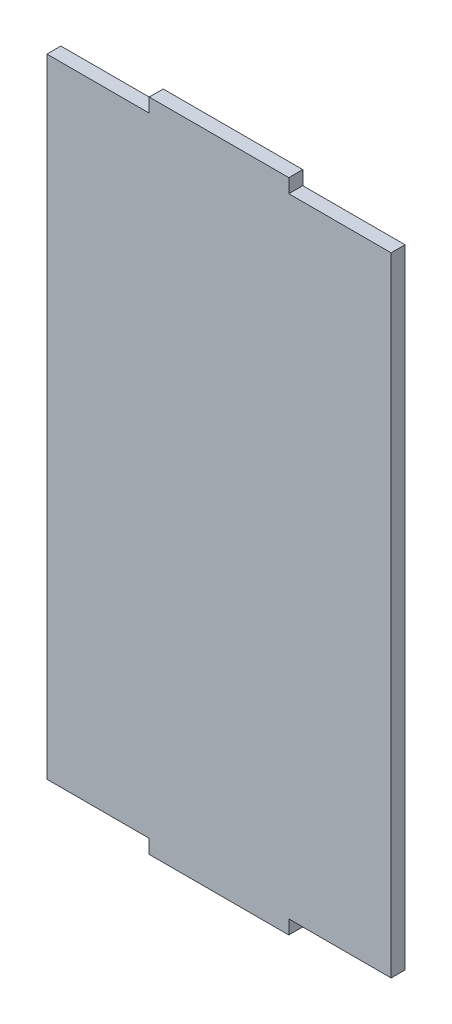
ISO-10303-21;
HEADER;
FILE_DESCRIPTION(('STEP AP214'),'2;1');
FILE_NAME('part.step','',(''),(''),'','','');
FILE_SCHEMA(('AUTOMOTIVE_DESIGN { 1 0 10303 214 1 1 1 1 }'));
ENDSEC;
DATA;
#1=APPLICATION_CONTEXT('core data for automotive mechanical design processes');
#2=APPLICATION_PROTOCOL_DEFINITION('international standard','automotive_design',2000,#1);
#3=PRODUCT_CONTEXT('',#1,'mechanical');
#4=PRODUCT('Part','Part','',(#3));
#5=PRODUCT_RELATED_PRODUCT_CATEGORY('part','',(#4));
#6=PRODUCT_DEFINITION_FORMATION('','',#4);
#7=PRODUCT_DEFINITION_CONTEXT('part definition',#1,'design');
#8=PRODUCT_DEFINITION('design','',#6,#7);
#9=PRODUCT_DEFINITION_SHAPE('','',#8);
#10=(LENGTH_UNIT() NAMED_UNIT(*) SI_UNIT(.MILLI.,.METRE.));
#11=(NAMED_UNIT(*) PLANE_ANGLE_UNIT() SI_UNIT($,.RADIAN.));
#12=(NAMED_UNIT(*) SI_UNIT($,.STERADIAN.) SOLID_ANGLE_UNIT());
#13=UNCERTAINTY_MEASURE_WITH_UNIT(LENGTH_MEASURE(1.E-05),#10,'distance_accuracy_value','');
#14=(GEOMETRIC_REPRESENTATION_CONTEXT(3) GLOBAL_UNCERTAINTY_ASSIGNED_CONTEXT((#13)) GLOBAL_UNIT_ASSIGNED_CONTEXT((#10,
#11,#12)) REPRESENTATION_CONTEXT('',''));
#15=CARTESIAN_POINT('',(0.,0.,0.));
#16=DIRECTION('',(0.,0.,1.));
#17=DIRECTION('',(1.,0.,0.));
#18=AXIS2_PLACEMENT_3D('',#15,#16,#17);
#19=CARTESIAN_POINT('',(0.,0.,3.));
#20=DIRECTION('',(1.,0.,0.));
#21=DIRECTION('',(0.,0.,-1.));
#22=AXIS2_PLACEMENT_3D('',#19,#20,#21);
#23=PLANE('',#22);
#24=DIRECTION('',(0.,-1.,0.));
#25=VECTOR('',#24,1.);
#26=CARTESIAN_POINT('',(0.,0.,0.));
#27=LINE('',#26,#25);
#28=CARTESIAN_POINT('',(0.,135.,0.));
#29=VERTEX_POINT('',#28);
#30=CARTESIAN_POINT('',(0.,0.,0.));
#31=VERTEX_POINT('',#30);
#32=EDGE_CURVE('E164',#29,#31,#27,.T.);
#33=ORIENTED_EDGE('',*,*,#32,.T.);
#34=DIRECTION('',(0.,0.,-1.));
#35=VECTOR('',#34,1.);
#36=CARTESIAN_POINT('',(0.,0.,3.));
#37=LINE('',#36,#35);
#38=CARTESIAN_POINT('',(0.,0.,3.));
#39=VERTEX_POINT('',#38);
#40=EDGE_CURVE('E11',#39,#31,#37,.T.);
#41=ORIENTED_EDGE('',*,*,#40,.F.);
#42=DIRECTION('',(0.,-1.,0.));
#43=VECTOR('',#42,1.);
#44=CARTESIAN_POINT('',(0.,0.,3.));
#45=LINE('',#44,#43);
#46=CARTESIAN_POINT('',(0.,135.,3.));
#47=VERTEX_POINT('',#46);
#48=EDGE_CURVE('E198',#47,#39,#45,.T.);
#49=ORIENTED_EDGE('',*,*,#48,.F.);
#50=DIRECTION('',(0.,0.,-1.));
#51=VECTOR('',#50,1.);
#52=CARTESIAN_POINT('',(0.,135.,3.));
#53=LINE('',#52,#51);
#54=EDGE_CURVE('E160',#47,#29,#53,.T.);
#55=ORIENTED_EDGE('',*,*,#54,.T.);
#56=EDGE_LOOP('',(#33,#41,#49,#55));
#57=FACE_BOUND('',#56,.T.);
#58=ADVANCED_FACE('F39',(#57),#23,.F.);
#59=CARTESIAN_POINT('',(0.,0.,3.));
#60=DIRECTION('',(0.,1.,0.));
#61=DIRECTION('',(0.,0.,1.));
#62=AXIS2_PLACEMENT_3D('',#59,#60,#61);
#63=PLANE('',#62);
#64=DIRECTION('',(1.,0.,0.));
#65=VECTOR('',#64,1.);
#66=CARTESIAN_POINT('',(0.,0.,0.));
#67=LINE('',#66,#65);
#68=CARTESIAN_POINT('',(22.,0.,0.));
#69=VERTEX_POINT('',#68);
#70=EDGE_CURVE('E168',#31,#69,#67,.T.);
#71=ORIENTED_EDGE('',*,*,#70,.T.);
#72=DIRECTION('',(0.,0.,-1.));
#73=VECTOR('',#72,1.);
#74=CARTESIAN_POINT('',(22.,0.,3.));
#75=LINE('',#74,#73);
#76=CARTESIAN_POINT('',(22.,0.,3.));
#77=VERTEX_POINT('',#76);
#78=EDGE_CURVE('E48',#77,#69,#75,.T.);
#79=ORIENTED_EDGE('',*,*,#78,.F.);
#80=DIRECTION('',(1.,0.,0.));
#81=VECTOR('',#80,1.);
#82=CARTESIAN_POINT('',(0.,0.,3.));
#83=LINE('',#82,#81);
#84=EDGE_CURVE('E111',#39,#77,#83,.T.);
#85=ORIENTED_EDGE('',*,*,#84,.F.);
#86=ORIENTED_EDGE('',*,*,#40,.T.);
#87=EDGE_LOOP('',(#71,#79,#85,#86));
#88=FACE_BOUND('',#87,.T.);
#89=ADVANCED_FACE('F292',(#88),#63,.F.);
#90=CARTESIAN_POINT('',(22.,0.,3.));
#91=DIRECTION('',(1.,0.,0.));
#92=DIRECTION('',(0.,0.,-1.));
#93=AXIS2_PLACEMENT_3D('',#90,#91,#92);
#94=PLANE('',#93);
#95=DIRECTION('',(0.,-1.,0.));
#96=VECTOR('',#95,1.);
#97=CARTESIAN_POINT('',(22.,0.,0.));
#98=LINE('',#97,#96);
#99=CARTESIAN_POINT('',(22.,-3.,0.));
#100=VERTEX_POINT('',#99);
#101=EDGE_CURVE('E171',#69,#100,#98,.T.);
#102=ORIENTED_EDGE('',*,*,#101,.T.);
#103=DIRECTION('',(0.,0.,-1.));
#104=VECTOR('',#103,1.);
#105=CARTESIAN_POINT('',(22.,-3.,3.));
#106=LINE('',#105,#104);
#107=CARTESIAN_POINT('',(22.,-3.,3.));
#108=VERTEX_POINT('',#107);
#109=EDGE_CURVE('E225',#108,#100,#106,.T.);
#110=ORIENTED_EDGE('',*,*,#109,.F.);
#111=DIRECTION('',(0.,-1.,0.));
#112=VECTOR('',#111,1.);
#113=CARTESIAN_POINT('',(22.,0.,3.));
#114=LINE('',#113,#112);
#115=EDGE_CURVE('E235',#77,#108,#114,.T.);
#116=ORIENTED_EDGE('',*,*,#115,.F.);
#117=ORIENTED_EDGE('',*,*,#78,.T.);
#118=EDGE_LOOP('',(#102,#110,#116,#117));
#119=FACE_BOUND('',#118,.T.);
#120=ADVANCED_FACE('F233',(#119),#94,.F.);
#121=CARTESIAN_POINT('',(22.,-3.,3.));
#122=DIRECTION('',(0.,1.,0.));
#123=DIRECTION('',(-1.,0.,0.));
#124=AXIS2_PLACEMENT_3D('',#121,#122,#123);
#125=PLANE('',#124);
#126=DIRECTION('',(1.,0.,0.));
#127=VECTOR('',#126,1.);
#128=CARTESIAN_POINT('',(22.,-3.,0.));
#129=LINE('',#128,#127);
#130=CARTESIAN_POINT('',(52.,-3.,0.));
#131=VERTEX_POINT('',#130);
#132=EDGE_CURVE('E174',#100,#131,#129,.T.);
#133=ORIENTED_EDGE('',*,*,#132,.T.);
#134=DIRECTION('',(0.,0.,-1.));
#135=VECTOR('',#134,1.);
#136=CARTESIAN_POINT('',(52.,-3.,3.));
#137=LINE('',#136,#135);
#138=CARTESIAN_POINT('',(52.,-3.,3.));
#139=VERTEX_POINT('',#138);
#140=EDGE_CURVE('E221',#139,#131,#137,.T.);
#141=ORIENTED_EDGE('',*,*,#140,.F.);
#142=DIRECTION('',(1.,0.,0.));
#143=VECTOR('',#142,1.);
#144=CARTESIAN_POINT('',(22.,-3.,3.));
#145=LINE('',#144,#143);
#146=EDGE_CURVE('E254',#108,#139,#145,.T.);
#147=ORIENTED_EDGE('',*,*,#146,.F.);
#148=ORIENTED_EDGE('',*,*,#109,.T.);
#149=EDGE_LOOP('',(#133,#141,#147,#148));
#150=FACE_BOUND('',#149,.T.);
#151=ADVANCED_FACE('F244',(#150),#125,.F.);
#152=CARTESIAN_POINT('',(52.,0.,3.));
#153=DIRECTION('',(-1.,0.,0.));
#154=DIRECTION('',(0.,-1.,0.));
#155=AXIS2_PLACEMENT_3D('',#152,#153,#154);
#156=PLANE('',#155);
#157=DIRECTION('',(0.,1.,0.));
#158=VECTOR('',#157,1.);
#159=CARTESIAN_POINT('',(52.,0.,0.));
#160=LINE('',#159,#158);
#161=CARTESIAN_POINT('',(52.,0.,0.));
#162=VERTEX_POINT('',#161);
#163=EDGE_CURVE('E177',#131,#162,#160,.T.);
#164=ORIENTED_EDGE('',*,*,#163,.T.);
#165=DIRECTION('',(0.,0.,-1.));
#166=VECTOR('',#165,1.);
#167=CARTESIAN_POINT('',(52.,0.,3.));
#168=LINE('',#167,#166);
#169=CARTESIAN_POINT('',(52.,0.,3.));
#170=VERTEX_POINT('',#169);
#171=EDGE_CURVE('E217',#170,#162,#168,.T.);
#172=ORIENTED_EDGE('',*,*,#171,.F.);
#173=DIRECTION('',(0.,1.,0.));
#174=VECTOR('',#173,1.);
#175=CARTESIAN_POINT('',(52.,0.,3.));
#176=LINE('',#175,#174);
#177=EDGE_CURVE('E250',#139,#170,#176,.T.);
#178=ORIENTED_EDGE('',*,*,#177,.F.);
#179=ORIENTED_EDGE('',*,*,#140,.T.);
#180=EDGE_LOOP('',(#164,#172,#178,#179));
#181=FACE_BOUND('',#180,.T.);
#182=ADVANCED_FACE('F248',(#181),#156,.F.);
#183=CARTESIAN_POINT('',(52.,0.,3.));
#184=DIRECTION('',(0.,1.,0.));
#185=DIRECTION('',(0.,0.,1.));
#186=AXIS2_PLACEMENT_3D('',#183,#184,#185);
#187=PLANE('',#186);
#188=DIRECTION('',(1.,0.,0.));
#189=VECTOR('',#188,1.);
#190=CARTESIAN_POINT('',(52.,0.,0.));
#191=LINE('',#190,#189);
#192=CARTESIAN_POINT('',(74.,0.,0.));
#193=VERTEX_POINT('',#192);
#194=EDGE_CURVE('E180',#162,#193,#191,.T.);
#195=ORIENTED_EDGE('',*,*,#194,.T.);
#196=DIRECTION('',(0.,0.,-1.));
#197=VECTOR('',#196,1.);
#198=CARTESIAN_POINT('',(74.,0.,3.));
#199=LINE('',#198,#197);
#200=CARTESIAN_POINT('',(74.,0.,3.));
#201=VERTEX_POINT('',#200);
#202=EDGE_CURVE('E213',#201,#193,#199,.T.);
#203=ORIENTED_EDGE('',*,*,#202,.F.);
#204=DIRECTION('',(1.,0.,0.));
#205=VECTOR('',#204,1.);
#206=CARTESIAN_POINT('',(52.,0.,3.));
#207=LINE('',#206,#205);
#208=EDGE_CURVE('E253',#170,#201,#207,.T.);
#209=ORIENTED_EDGE('',*,*,#208,.F.);
#210=ORIENTED_EDGE('',*,*,#171,.T.);
#211=EDGE_LOOP('',(#195,#203,#209,#210));
#212=FACE_BOUND('',#211,.T.);
#213=ADVANCED_FACE('F305',(#212),#187,.F.);
#214=CARTESIAN_POINT('',(74.,0.,3.));
#215=DIRECTION('',(-1.,0.,0.));
#216=DIRECTION('',(0.,0.,1.));
#217=AXIS2_PLACEMENT_3D('',#214,#215,#216);
#218=PLANE('',#217);
#219=DIRECTION('',(0.,1.,0.));
#220=VECTOR('',#219,1.);
#221=CARTESIAN_POINT('',(74.,0.,0.));
#222=LINE('',#221,#220);
#223=CARTESIAN_POINT('',(74.,135.,0.));
#224=VERTEX_POINT('',#223);
#225=EDGE_CURVE('E183',#193,#224,#222,.T.);
#226=ORIENTED_EDGE('',*,*,#225,.T.);
#227=DIRECTION('',(0.,0.,-1.));
#228=VECTOR('',#227,1.);
#229=CARTESIAN_POINT('',(74.,135.,3.));
#230=LINE('',#229,#228);
#231=CARTESIAN_POINT('',(74.,135.,3.));
#232=VERTEX_POINT('',#231);
#233=EDGE_CURVE('E209',#232,#224,#230,.T.);
#234=ORIENTED_EDGE('',*,*,#233,.F.);
#235=DIRECTION('',(0.,1.,0.));
#236=VECTOR('',#235,1.);
#237=CARTESIAN_POINT('',(74.,0.,3.));
#238=LINE('',#237,#236);
#239=EDGE_CURVE('E258',#201,#232,#238,.T.);
#240=ORIENTED_EDGE('',*,*,#239,.F.);
#241=ORIENTED_EDGE('',*,*,#202,.T.);
#242=EDGE_LOOP('',(#226,#234,#240,#241));
#243=FACE_BOUND('',#242,.T.);
#244=ADVANCED_FACE('F308',(#243),#218,.F.);
#245=CARTESIAN_POINT('',(52.,135.,3.));
#246=DIRECTION('',(0.,-1.,0.));
#247=DIRECTION('',(0.,0.,-1.));
#248=AXIS2_PLACEMENT_3D('',#245,#246,#247);
#249=PLANE('',#248);
#250=DIRECTION('',(-1.,0.,0.));
#251=VECTOR('',#250,1.);
#252=CARTESIAN_POINT('',(52.,135.,0.));
#253=LINE('',#252,#251);
#254=CARTESIAN_POINT('',(52.,135.,0.));
#255=VERTEX_POINT('',#254);
#256=EDGE_CURVE('E186',#224,#255,#253,.T.);
#257=ORIENTED_EDGE('',*,*,#256,.T.);
#258=DIRECTION('',(0.,0.,-1.));
#259=VECTOR('',#258,1.);
#260=CARTESIAN_POINT('',(52.,135.,3.));
#261=LINE('',#260,#259);
#262=CARTESIAN_POINT('',(52.,135.,3.));
#263=VERTEX_POINT('',#262);
#264=EDGE_CURVE('E205',#263,#255,#261,.T.);
#265=ORIENTED_EDGE('',*,*,#264,.F.);
#266=DIRECTION('',(-1.,0.,0.));
#267=VECTOR('',#266,1.);
#268=CARTESIAN_POINT('',(52.,135.,3.));
#269=LINE('',#268,#267);
#270=EDGE_CURVE('E265',#232,#263,#269,.T.);
#271=ORIENTED_EDGE('',*,*,#270,.F.);
#272=ORIENTED_EDGE('',*,*,#233,.T.);
#273=EDGE_LOOP('',(#257,#265,#271,#272));
#274=FACE_BOUND('',#273,.T.);
#275=ADVANCED_FACE('F273',(#274),#249,.F.);
#276=CARTESIAN_POINT('',(52.,135.,3.));
#277=DIRECTION('',(-1.,0.,0.));
#278=DIRECTION('',(0.,0.,1.));
#279=AXIS2_PLACEMENT_3D('',#276,#277,#278);
#280=PLANE('',#279);
#281=DIRECTION('',(0.,1.,0.));
#282=VECTOR('',#281,1.);
#283=CARTESIAN_POINT('',(52.,135.,0.));
#284=LINE('',#283,#282);
#285=CARTESIAN_POINT('',(52.,138.,0.));
#286=VERTEX_POINT('',#285);
#287=EDGE_CURVE('E189',#255,#286,#284,.T.);
#288=ORIENTED_EDGE('',*,*,#287,.T.);
#289=DIRECTION('',(0.,0.,-1.));
#290=VECTOR('',#289,1.);
#291=CARTESIAN_POINT('',(52.,138.,3.));
#292=LINE('',#291,#290);
#293=CARTESIAN_POINT('',(52.,138.,3.));
#294=VERTEX_POINT('',#293);
#295=EDGE_CURVE('E153',#294,#286,#292,.T.);
#296=ORIENTED_EDGE('',*,*,#295,.F.);
#297=DIRECTION('',(0.,1.,0.));
#298=VECTOR('',#297,1.);
#299=CARTESIAN_POINT('',(52.,135.,3.));
#300=LINE('',#299,#298);
#301=EDGE_CURVE('E142',#263,#294,#300,.T.);
#302=ORIENTED_EDGE('',*,*,#301,.F.);
#303=ORIENTED_EDGE('',*,*,#264,.T.);
#304=EDGE_LOOP('',(#288,#296,#302,#303));
#305=FACE_BOUND('',#304,.T.);
#306=ADVANCED_FACE('F277',(#305),#280,.F.);
#307=CARTESIAN_POINT('',(22.,138.,3.));
#308=DIRECTION('',(0.,-1.,0.));
#309=DIRECTION('',(0.,0.,-1.));
#310=AXIS2_PLACEMENT_3D('',#307,#308,#309);
#311=PLANE('',#310);
#312=DIRECTION('',(-1.,0.,0.));
#313=VECTOR('',#312,1.);
#314=CARTESIAN_POINT('',(22.,138.,0.));
#315=LINE('',#314,#313);
#316=CARTESIAN_POINT('',(22.,138.,0.));
#317=VERTEX_POINT('',#316);
#318=EDGE_CURVE('E151',#286,#317,#315,.T.);
#319=ORIENTED_EDGE('',*,*,#318,.T.);
#320=DIRECTION('',(0.,0.,-1.));
#321=VECTOR('',#320,1.);
#322=CARTESIAN_POINT('',(22.,138.,3.));
#323=LINE('',#322,#321);
#324=CARTESIAN_POINT('',(22.,138.,3.));
#325=VERTEX_POINT('',#324);
#326=EDGE_CURVE('E148',#325,#317,#323,.T.);
#327=ORIENTED_EDGE('',*,*,#326,.F.);
#328=DIRECTION('',(-1.,0.,0.));
#329=VECTOR('',#328,1.);
#330=CARTESIAN_POINT('',(22.,138.,3.));
#331=LINE('',#330,#329);
#332=EDGE_CURVE('E136',#294,#325,#331,.T.);
#333=ORIENTED_EDGE('',*,*,#332,.F.);
#334=ORIENTED_EDGE('',*,*,#295,.T.);
#335=EDGE_LOOP('',(#319,#327,#333,#334));
#336=FACE_BOUND('',#335,.T.);
#337=ADVANCED_FACE('F149',(#336),#311,.F.);
#338=CARTESIAN_POINT('',(22.,135.,3.));
#339=DIRECTION('',(1.,0.,0.));
#340=DIRECTION('',(0.,0.,-1.));
#341=AXIS2_PLACEMENT_3D('',#338,#339,#340);
#342=PLANE('',#341);
#343=DIRECTION('',(0.,-1.,0.));
#344=VECTOR('',#343,1.);
#345=CARTESIAN_POINT('',(22.,135.,0.));
#346=LINE('',#345,#344);
#347=CARTESIAN_POINT('',(22.,135.,0.));
#348=VERTEX_POINT('',#347);
#349=EDGE_CURVE('E97',#317,#348,#346,.T.);
#350=ORIENTED_EDGE('',*,*,#349,.T.);
#351=DIRECTION('',(0.,0.,-1.));
#352=VECTOR('',#351,1.);
#353=CARTESIAN_POINT('',(22.,135.,3.));
#354=LINE('',#353,#352);
#355=CARTESIAN_POINT('',(22.,135.,3.));
#356=VERTEX_POINT('',#355);
#357=EDGE_CURVE('E154',#356,#348,#354,.T.);
#358=ORIENTED_EDGE('',*,*,#357,.F.);
#359=DIRECTION('',(0.,-1.,0.));
#360=VECTOR('',#359,1.);
#361=CARTESIAN_POINT('',(22.,135.,3.));
#362=LINE('',#361,#360);
#363=EDGE_CURVE('E140',#325,#356,#362,.T.);
#364=ORIENTED_EDGE('',*,*,#363,.F.);
#365=ORIENTED_EDGE('',*,*,#326,.T.);
#366=EDGE_LOOP('',(#350,#358,#364,#365));
#367=FACE_BOUND('',#366,.T.);
#368=ADVANCED_FACE('F156',(#367),#342,.F.);
#369=CARTESIAN_POINT('',(0.,135.,3.));
#370=DIRECTION('',(0.,-1.,0.));
#371=DIRECTION('',(0.,0.,-1.));
#372=AXIS2_PLACEMENT_3D('',#369,#370,#371);
#373=PLANE('',#372);
#374=DIRECTION('',(-1.,0.,0.));
#375=VECTOR('',#374,1.);
#376=CARTESIAN_POINT('',(0.,135.,0.));
#377=LINE('',#376,#375);
#378=EDGE_CURVE('E103',#348,#29,#377,.T.);
#379=ORIENTED_EDGE('',*,*,#378,.T.);
#380=ORIENTED_EDGE('',*,*,#54,.F.);
#381=DIRECTION('',(-1.,0.,0.));
#382=VECTOR('',#381,1.);
#383=CARTESIAN_POINT('',(0.,135.,3.));
#384=LINE('',#383,#382);
#385=EDGE_CURVE('E56',#356,#47,#384,.T.);
#386=ORIENTED_EDGE('',*,*,#385,.F.);
#387=ORIENTED_EDGE('',*,*,#357,.T.);
#388=EDGE_LOOP('',(#379,#380,#386,#387));
#389=FACE_BOUND('',#388,.T.);
#390=ADVANCED_FACE('F281',(#389),#373,.F.);
#391=CARTESIAN_POINT('',(0.,0.,3.));
#392=DIRECTION('',(0.,0.,-1.));
#393=DIRECTION('',(-1.,0.,0.));
#394=AXIS2_PLACEMENT_3D('',#391,#392,#393);
#395=PLANE('',#394);
#396=ORIENTED_EDGE('',*,*,#48,.T.);
#397=ORIENTED_EDGE('',*,*,#84,.T.);
#398=ORIENTED_EDGE('',*,*,#115,.T.);
#399=ORIENTED_EDGE('',*,*,#146,.T.);
#400=ORIENTED_EDGE('',*,*,#177,.T.);
#401=ORIENTED_EDGE('',*,*,#208,.T.);
#402=ORIENTED_EDGE('',*,*,#239,.T.);
#403=ORIENTED_EDGE('',*,*,#270,.T.);
#404=ORIENTED_EDGE('',*,*,#301,.T.);
#405=ORIENTED_EDGE('',*,*,#332,.T.);
#406=ORIENTED_EDGE('',*,*,#363,.T.);
#407=ORIENTED_EDGE('',*,*,#385,.T.);
#408=EDGE_LOOP('',(#396,#397,#398,#399,#400,#401,#402,#403,#404,#405,#406,#407));
#409=FACE_BOUND('',#408,.T.);
#410=ADVANCED_FACE('F138',(#409),#395,.F.);
#411=CARTESIAN_POINT('',(0.,0.,0.));
#412=DIRECTION('',(0.,0.,-1.));
#413=DIRECTION('',(-1.,0.,0.));
#414=AXIS2_PLACEMENT_3D('',#411,#412,#413);
#415=PLANE('',#414);
#416=ORIENTED_EDGE('',*,*,#32,.F.);
#417=ORIENTED_EDGE('',*,*,#378,.F.);
#418=ORIENTED_EDGE('',*,*,#349,.F.);
#419=ORIENTED_EDGE('',*,*,#318,.F.);
#420=ORIENTED_EDGE('',*,*,#287,.F.);
#421=ORIENTED_EDGE('',*,*,#256,.F.);
#422=ORIENTED_EDGE('',*,*,#225,.F.);
#423=ORIENTED_EDGE('',*,*,#194,.F.);
#424=ORIENTED_EDGE('',*,*,#163,.F.);
#425=ORIENTED_EDGE('',*,*,#132,.F.);
#426=ORIENTED_EDGE('',*,*,#101,.F.);
#427=ORIENTED_EDGE('',*,*,#70,.F.);
#428=EDGE_LOOP('',(#416,#417,#418,#419,#420,#421,#422,#423,#424,#425,#426,#427));
#429=FACE_BOUND('',#428,.T.);
#430=ADVANCED_FACE('F239',(#429),#415,.T.);
#431=CLOSED_SHELL('',(#58,#89,#120,#151,#182,#213,#244,#275,#306,#337,#368,#390,#410,#430));
#432=MANIFOLD_SOLID_BREP('B2',#431);
#433=ADVANCED_BREP_SHAPE_REPRESENTATION('',(#18,#432),#14);
#434=SHAPE_DEFINITION_REPRESENTATION(#9,#433);
ENDSEC;
END-ISO-10303-21;
